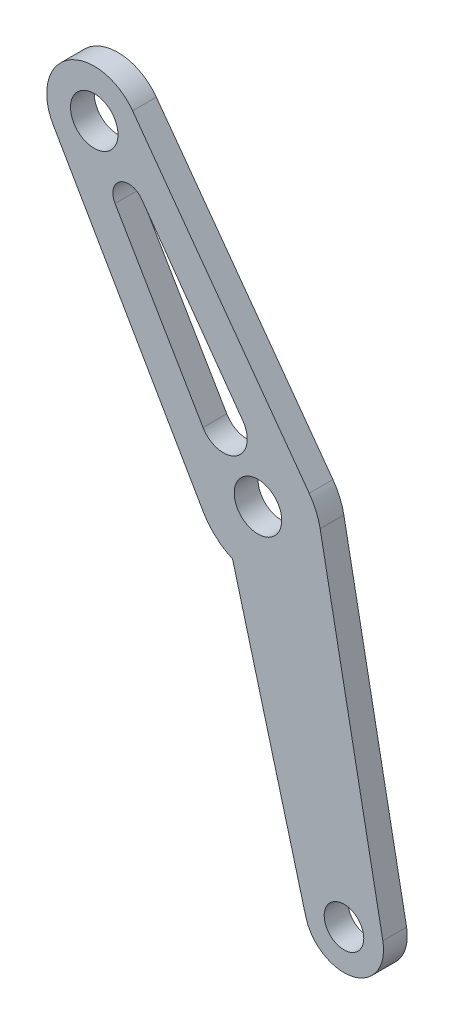
ISO-10303-21;
HEADER;
FILE_DESCRIPTION(('STEP AP214'),'2;1');
FILE_NAME('part.step','',(''),(''),'','','');
FILE_SCHEMA(('AUTOMOTIVE_DESIGN { 1 0 10303 214 1 1 1 1 }'));
ENDSEC;
DATA;
#1=APPLICATION_CONTEXT('core data for automotive mechanical design processes');
#2=APPLICATION_PROTOCOL_DEFINITION('international standard','automotive_design',2000,#1);
#3=PRODUCT_CONTEXT('',#1,'mechanical');
#4=PRODUCT('Part','Part','',(#3));
#5=PRODUCT_RELATED_PRODUCT_CATEGORY('part','',(#4));
#6=PRODUCT_DEFINITION_FORMATION('','',#4);
#7=PRODUCT_DEFINITION_CONTEXT('part definition',#1,'design');
#8=PRODUCT_DEFINITION('design','',#6,#7);
#9=PRODUCT_DEFINITION_SHAPE('','',#8);
#10=(LENGTH_UNIT() NAMED_UNIT(*) SI_UNIT(.MILLI.,.METRE.));
#11=(NAMED_UNIT(*) PLANE_ANGLE_UNIT() SI_UNIT($,.RADIAN.));
#12=(NAMED_UNIT(*) SI_UNIT($,.STERADIAN.) SOLID_ANGLE_UNIT());
#13=UNCERTAINTY_MEASURE_WITH_UNIT(LENGTH_MEASURE(1.E-05),#10,'distance_accuracy_value','');
#14=(GEOMETRIC_REPRESENTATION_CONTEXT(3) GLOBAL_UNCERTAINTY_ASSIGNED_CONTEXT((#13)) GLOBAL_UNIT_ASSIGNED_CONTEXT((#10,
#11,#12)) REPRESENTATION_CONTEXT('',''));
#15=CARTESIAN_POINT('',(0.,0.,0.));
#16=DIRECTION('',(0.,0.,1.));
#17=DIRECTION('',(1.,0.,0.));
#18=AXIS2_PLACEMENT_3D('',#15,#16,#17);
#19=CARTESIAN_POINT('',(4.90972826709962,0.945816231222002,3.));
#20=DIRECTION('',(-0.981945653419923,-0.1891632462444,0.));
#21=DIRECTION('',(0.1891632462444,-0.981945653419924,0.));
#22=AXIS2_PLACEMENT_3D('',#19,#20,#21);
#23=PLANE('',#22);
#24=DIRECTION('',(-0.1891632462444,0.981945653419924,0.));
#25=VECTOR('',#24,1.);
#26=CARTESIAN_POINT('',(4.90972826709962,0.945816231222002,0.));
#27=LINE('',#26,#25);
#28=CARTESIAN_POINT('',(4.90972826709962,0.945816231222002,0.));
#29=VERTEX_POINT('',#28);
#30=CARTESIAN_POINT('',(-3.01483466694652,42.0821906740961,0.));
#31=VERTEX_POINT('',#30);
#32=EDGE_CURVE('E192',#29,#31,#27,.T.);
#33=ORIENTED_EDGE('',*,*,#32,.T.);
#34=DIRECTION('',(0.,0.,-1.));
#35=VECTOR('',#34,1.);
#36=CARTESIAN_POINT('',(-3.01483466694652,42.0821906740961,3.));
#37=LINE('',#36,#35);
#38=CARTESIAN_POINT('',(-3.01483466694652,42.0821906740961,3.));
#39=VERTEX_POINT('',#38);
#40=EDGE_CURVE('E13',#39,#31,#37,.T.);
#41=ORIENTED_EDGE('',*,*,#40,.F.);
#42=DIRECTION('',(-0.1891632462444,0.981945653419924,0.));
#43=VECTOR('',#42,1.);
#44=CARTESIAN_POINT('',(4.90972826709962,0.945816231222002,3.));
#45=LINE('',#44,#43);
#46=CARTESIAN_POINT('',(4.90972826709962,0.945816231222002,3.));
#47=VERTEX_POINT('',#46);
#48=EDGE_CURVE('E259',#47,#39,#45,.T.);
#49=ORIENTED_EDGE('',*,*,#48,.F.);
#50=DIRECTION('',(0.,0.,-1.));
#51=VECTOR('',#50,1.);
#52=CARTESIAN_POINT('',(4.90972826709962,0.945816231222002,3.));
#53=LINE('',#52,#51);
#54=EDGE_CURVE('E209',#47,#29,#53,.T.);
#55=ORIENTED_EDGE('',*,*,#54,.T.);
#56=EDGE_LOOP('',(#33,#41,#49,#55));
#57=FACE_BOUND('',#56,.T.);
#58=ADVANCED_FACE('F47',(#57),#23,.F.);
#59=CARTESIAN_POINT('',(-10.8703998943059,40.5688847041409,3.));
#60=DIRECTION('',(0.,0.,-1.));
#61=DIRECTION('',(-1.,0.,0.));
#62=AXIS2_PLACEMENT_3D('',#59,#60,#61);
#63=CYLINDRICAL_SURFACE('',#62,8.);
#64=CARTESIAN_POINT('',(-10.8703998943059,40.5688847041409,0.));
#65=DIRECTION('',(0.,0.,1.));
#66=DIRECTION('',(1.,0.,0.));
#67=AXIS2_PLACEMENT_3D('',#64,#65,#66);
#68=CIRCLE('',#67,8.);
#69=CARTESIAN_POINT('',(-4.39965624272183,45.2730824673609,0.));
#70=VERTEX_POINT('',#69);
#71=EDGE_CURVE('E195',#31,#70,#68,.T.);
#72=ORIENTED_EDGE('',*,*,#71,.T.);
#73=DIRECTION('',(0.,0.,-1.));
#74=VECTOR('',#73,1.);
#75=CARTESIAN_POINT('',(-4.39965624272183,45.2730824673609,3.));
#76=LINE('',#75,#74);
#77=CARTESIAN_POINT('',(-4.39965624272183,45.2730824673609,3.));
#78=VERTEX_POINT('',#77);
#79=EDGE_CURVE('E57',#78,#70,#76,.T.);
#80=ORIENTED_EDGE('',*,*,#79,.F.);
#81=CARTESIAN_POINT('',(-10.8703998943059,40.5688847041409,3.));
#82=DIRECTION('',(0.,0.,1.));
#83=DIRECTION('',(1.,0.,0.));
#84=AXIS2_PLACEMENT_3D('',#81,#82,#83);
#85=CIRCLE('',#84,8.);
#86=EDGE_CURVE('E261',#39,#78,#85,.T.);
#87=ORIENTED_EDGE('',*,*,#86,.F.);
#88=ORIENTED_EDGE('',*,*,#40,.T.);
#89=EDGE_LOOP('',(#72,#80,#87,#88));
#90=FACE_BOUND('',#89,.T.);
#91=ADVANCED_FACE('F294',(#90),#63,.T.);
#92=CARTESIAN_POINT('',(18.6543941988296,13.5616498179272,3.));
#93=DIRECTION('',(0.808842956448011,0.588024720402503,0.));
#94=DIRECTION('',(-0.588024720402503,0.808842956448011,0.));
#95=AXIS2_PLACEMENT_3D('',#92,#93,#94);
#96=PLANE('',#95);
#97=DIRECTION('',(0.588024720402503,-0.808842956448011,0.));
#98=VECTOR('',#97,1.);
#99=CARTESIAN_POINT('',(18.6543941988296,13.5616498179272,0.));
#100=LINE('',#99,#98);
#101=CARTESIAN_POINT('',(-26.7136254861889,75.966514608482,0.));
#102=VERTEX_POINT('',#101);
#103=EDGE_CURVE('E198',#102,#70,#100,.T.);
#104=ORIENTED_EDGE('',*,*,#103,.F.);
#105=DIRECTION('',(0.,0.,-1.));
#106=VECTOR('',#105,1.);
#107=CARTESIAN_POINT('',(-26.7136254861889,75.966514608482,3.));
#108=LINE('',#107,#106);
#109=CARTESIAN_POINT('',(-26.7136254861889,75.966514608482,3.));
#110=VERTEX_POINT('',#109);
#111=EDGE_CURVE('E216',#110,#102,#108,.T.);
#112=ORIENTED_EDGE('',*,*,#111,.F.);
#113=DIRECTION('',(0.588024720402503,-0.808842956448011,0.));
#114=VECTOR('',#113,1.);
#115=CARTESIAN_POINT('',(18.6543941988296,13.5616498179272,3.));
#116=LINE('',#115,#114);
#117=EDGE_CURVE('E263',#110,#78,#116,.T.);
#118=ORIENTED_EDGE('',*,*,#117,.T.);
#119=ORIENTED_EDGE('',*,*,#79,.T.);
#120=EDGE_LOOP('',(#104,#112,#118,#119));
#121=FACE_BOUND('',#120,.T.);
#122=ADVANCED_FACE('F299',(#121),#96,.T.);
#123=CARTESIAN_POINT('',(-31.566683224877,72.438366286067,3.));
#124=DIRECTION('',(0.,0.,-1.));
#125=DIRECTION('',(-1.,0.,0.));
#126=AXIS2_PLACEMENT_3D('',#123,#124,#125);
#127=CYLINDRICAL_SURFACE('',#126,6.);
#128=CARTESIAN_POINT('',(-31.566683224877,72.438366286067,0.));
#129=DIRECTION('',(0.,0.,1.));
#130=DIRECTION('',(1.,0.,0.));
#131=AXIS2_PLACEMENT_3D('',#128,#129,#130);
#132=CIRCLE('',#131,6.);
#133=CARTESIAN_POINT('',(-36.7637235119956,69.4399046381438,0.));
#134=VERTEX_POINT('',#133);
#135=EDGE_CURVE('E201',#102,#134,#132,.T.);
#136=ORIENTED_EDGE('',*,*,#135,.T.);
#137=DIRECTION('',(0.,0.,-1.));
#138=VECTOR('',#137,1.);
#139=CARTESIAN_POINT('',(-36.7637235119956,69.4399046381438,3.));
#140=LINE('',#139,#138);
#141=CARTESIAN_POINT('',(-36.7637235119956,69.4399046381438,3.));
#142=VERTEX_POINT('',#141);
#143=EDGE_CURVE('E213',#142,#134,#140,.T.);
#144=ORIENTED_EDGE('',*,*,#143,.F.);
#145=CARTESIAN_POINT('',(-31.566683224877,72.438366286067,3.));
#146=DIRECTION('',(0.,0.,1.));
#147=DIRECTION('',(1.,0.,0.));
#148=AXIS2_PLACEMENT_3D('',#145,#146,#147);
#149=CIRCLE('',#148,6.);
#150=EDGE_CURVE('E266',#110,#142,#149,.T.);
#151=ORIENTED_EDGE('',*,*,#150,.F.);
#152=ORIENTED_EDGE('',*,*,#111,.T.);
#153=EDGE_LOOP('',(#136,#144,#151,#152));
#154=FACE_BOUND('',#153,.T.);
#155=ADVANCED_FACE('F271',(#154),#127,.T.);
#156=CARTESIAN_POINT('',(2.47586114288567,1.42846202307234,3.));
#157=DIRECTION('',(0.866173381186435,0.499743607987195,0.));
#158=DIRECTION('',(-0.499743607987195,0.866173381186435,0.));
#159=AXIS2_PLACEMENT_3D('',#156,#157,#158);
#160=PLANE('',#159);
#161=DIRECTION('',(0.499743607987195,-0.866173381186435,0.));
#162=VECTOR('',#161,1.);
#163=CARTESIAN_POINT('',(2.47586114288567,1.42846202307234,0.));
#164=LINE('',#163,#162);
#165=CARTESIAN_POINT('',(-17.7997869437974,36.5709358402433,0.));
#166=VERTEX_POINT('',#165);
#167=EDGE_CURVE('E203',#134,#166,#164,.T.);
#168=ORIENTED_EDGE('',*,*,#167,.T.);
#169=DIRECTION('',(0.,0.,-1.));
#170=VECTOR('',#169,1.);
#171=CARTESIAN_POINT('',(-17.7997869437974,36.5709358402433,3.));
#172=LINE('',#171,#170);
#173=CARTESIAN_POINT('',(-17.7997869437974,36.5709358402433,3.));
#174=VERTEX_POINT('',#173);
#175=EDGE_CURVE('E162',#174,#166,#172,.T.);
#176=ORIENTED_EDGE('',*,*,#175,.F.);
#177=DIRECTION('',(0.499743607987195,-0.866173381186435,0.));
#178=VECTOR('',#177,1.);
#179=CARTESIAN_POINT('',(2.47586114288567,1.42846202307234,3.));
#180=LINE('',#179,#178);
#181=EDGE_CURVE('E153',#142,#174,#180,.T.);
#182=ORIENTED_EDGE('',*,*,#181,.F.);
#183=ORIENTED_EDGE('',*,*,#143,.T.);
#184=EDGE_LOOP('',(#168,#176,#182,#183));
#185=FACE_BOUND('',#184,.T.);
#186=ADVANCED_FACE('F275',(#185),#160,.F.);
#187=CARTESIAN_POINT('',(-10.8703998943059,40.5688847041409,3.));
#188=DIRECTION('',(0.,0.,-1.));
#189=DIRECTION('',(-1.,0.,0.));
#190=AXIS2_PLACEMENT_3D('',#187,#188,#189);
#191=CYLINDRICAL_SURFACE('',#190,8.00000000000001);
#192=CARTESIAN_POINT('',(-10.8703998943059,40.5688847041409,0.));
#193=DIRECTION('',(0.,0.,1.));
#194=DIRECTION('',(1.,0.,0.));
#195=AXIS2_PLACEMENT_3D('',#192,#193,#194);
#196=CIRCLE('',#195,8.00000000000001);
#197=CARTESIAN_POINT('',(-14.0837046071386,33.2425846268517,0.));
#198=VERTEX_POINT('',#197);
#199=EDGE_CURVE('E161',#166,#198,#196,.T.);
#200=ORIENTED_EDGE('',*,*,#199,.T.);
#201=DIRECTION('',(0.,0.,-1.));
#202=VECTOR('',#201,1.);
#203=CARTESIAN_POINT('',(-14.0837046071386,33.2425846268517,3.));
#204=LINE('',#203,#202);
#205=CARTESIAN_POINT('',(-14.0837046071386,33.2425846268517,3.));
#206=VERTEX_POINT('',#205);
#207=EDGE_CURVE('E158',#206,#198,#204,.T.);
#208=ORIENTED_EDGE('',*,*,#207,.F.);
#209=CARTESIAN_POINT('',(-10.8703998943059,40.5688847041409,3.));
#210=DIRECTION('',(0.,0.,1.));
#211=DIRECTION('',(1.,0.,0.));
#212=AXIS2_PLACEMENT_3D('',#209,#210,#211);
#213=CIRCLE('',#212,8.00000000000001);
#214=EDGE_CURVE('E147',#174,#206,#213,.T.);
#215=ORIENTED_EDGE('',*,*,#214,.F.);
#216=ORIENTED_EDGE('',*,*,#175,.T.);
#217=EDGE_LOOP('',(#200,#208,#215,#216));
#218=FACE_BOUND('',#217,.T.);
#219=ADVANCED_FACE('F159',(#218),#191,.T.);
#220=CARTESIAN_POINT('',(-4.82962913144533,-1.29409522551261,3.));
#221=DIRECTION('',(0.965925826289068,0.258819045102522,0.));
#222=DIRECTION('',(-0.258819045102522,0.965925826289068,0.));
#223=AXIS2_PLACEMENT_3D('',#220,#221,#222);
#224=PLANE('',#223);
#225=DIRECTION('',(0.258819045102522,-0.965925826289068,0.));
#226=VECTOR('',#225,1.);
#227=CARTESIAN_POINT('',(-4.82962913144533,-1.29409522551261,0.));
#228=LINE('',#227,#226);
#229=CARTESIAN_POINT('',(-4.82962913144533,-1.29409522551261,0.));
#230=VERTEX_POINT('',#229);
#231=EDGE_CURVE('E107',#198,#230,#228,.T.);
#232=ORIENTED_EDGE('',*,*,#231,.T.);
#233=DIRECTION('',(0.,0.,-1.));
#234=VECTOR('',#233,1.);
#235=CARTESIAN_POINT('',(-4.82962913144533,-1.29409522551261,3.));
#236=LINE('',#235,#234);
#237=CARTESIAN_POINT('',(-4.82962913144533,-1.29409522551261,3.));
#238=VERTEX_POINT('',#237);
#239=EDGE_CURVE('E163',#238,#230,#236,.T.);
#240=ORIENTED_EDGE('',*,*,#239,.F.);
#241=DIRECTION('',(0.258819045102522,-0.965925826289068,0.));
#242=VECTOR('',#241,1.);
#243=CARTESIAN_POINT('',(-4.82962913144533,-1.29409522551261,3.));
#244=LINE('',#243,#242);
#245=EDGE_CURVE('E151',#206,#238,#244,.T.);
#246=ORIENTED_EDGE('',*,*,#245,.F.);
#247=ORIENTED_EDGE('',*,*,#207,.T.);
#248=EDGE_LOOP('',(#232,#240,#246,#247));
#249=FACE_BOUND('',#248,.T.);
#250=ADVANCED_FACE('F165',(#249),#224,.F.);
#251=CARTESIAN_POINT('',(-15.2275121744261,47.2782492477043,3.));
#252=DIRECTION('',(0.,0.,-1.));
#253=DIRECTION('',(-1.,0.,0.));
#254=AXIS2_PLACEMENT_3D('',#251,#252,#253);
#255=CYLINDRICAL_SURFACE('',#254,3.00000000000001);
#256=CARTESIAN_POINT('',(-15.2275121744261,47.2782492477043,0.));
#257=DIRECTION('',(0.,0.,1.));
#258=DIRECTION('',(1.,0.,0.));
#259=AXIS2_PLACEMENT_3D('',#256,#257,#258);
#260=CIRCLE('',#259,3.00000000000001);
#261=CARTESIAN_POINT('',(-17.8151923079949,45.760385114676,0.));
#262=VERTEX_POINT('',#261);
#263=CARTESIAN_POINT('',(-12.7883699594978,49.0248417174449,0.));
#264=VERTEX_POINT('',#263);
#265=EDGE_CURVE('E171',#262,#264,#260,.T.);
#266=ORIENTED_EDGE('',*,*,#265,.F.);
#267=DIRECTION('',(0.,0.,-1.));
#268=VECTOR('',#267,1.);
#269=CARTESIAN_POINT('',(-17.8151923079949,45.760385114676,3.));
#270=LINE('',#269,#268);
#271=CARTESIAN_POINT('',(-17.8151923079949,45.760385114676,3.));
#272=VERTEX_POINT('',#271);
#273=EDGE_CURVE('E51',#272,#262,#270,.T.);
#274=ORIENTED_EDGE('',*,*,#273,.F.);
#275=CARTESIAN_POINT('',(-15.2275121744261,47.2782492477043,3.));
#276=DIRECTION('',(0.,0.,1.));
#277=DIRECTION('',(1.,0.,0.));
#278=AXIS2_PLACEMENT_3D('',#275,#276,#277);
#279=CIRCLE('',#278,3.00000000000001);
#280=CARTESIAN_POINT('',(-12.7883699594978,49.0248417174449,3.));
#281=VERTEX_POINT('',#280);
#282=EDGE_CURVE('E208',#272,#281,#279,.T.);
#283=ORIENTED_EDGE('',*,*,#282,.T.);
#284=DIRECTION('',(0.,0.,-1.));
#285=VECTOR('',#284,1.);
#286=CARTESIAN_POINT('',(-12.7883699594978,49.0248417174449,3.));
#287=LINE('',#286,#285);
#288=EDGE_CURVE('E167',#281,#264,#287,.T.);
#289=ORIENTED_EDGE('',*,*,#288,.T.);
#290=EDGE_LOOP('',(#266,#274,#283,#289));
#291=FACE_BOUND('',#290,.T.);
#292=ADVANCED_FACE('F49',(#291),#255,.F.);
#293=CARTESIAN_POINT('',(6.71590057677353,3.93936811363535,3.));
#294=DIRECTION('',(0.862560044522915,0.505954711009421,0.));
#295=DIRECTION('',(-0.505954711009421,0.862560044522915,0.));
#296=AXIS2_PLACEMENT_3D('',#293,#294,#295);
#297=PLANE('',#296);
#298=DIRECTION('',(0.505954711009421,-0.862560044522915,0.));
#299=VECTOR('',#298,1.);
#300=CARTESIAN_POINT('',(6.71590057677353,3.93936811363535,0.));
#301=LINE('',#300,#299);
#302=CARTESIAN_POINT('',(-28.9346910338026,64.7170923204847,0.));
#303=VERTEX_POINT('',#302);
#304=EDGE_CURVE('E174',#303,#262,#301,.T.);
#305=ORIENTED_EDGE('',*,*,#304,.F.);
#306=DIRECTION('',(0.,0.,-1.));
#307=VECTOR('',#306,1.);
#308=CARTESIAN_POINT('',(-28.9346910338026,64.7170923204847,3.));
#309=LINE('',#308,#307);
#310=CARTESIAN_POINT('',(-28.9346910338026,64.7170923204847,3.));
#311=VERTEX_POINT('',#310);
#312=EDGE_CURVE('E221',#311,#303,#309,.T.);
#313=ORIENTED_EDGE('',*,*,#312,.F.);
#314=DIRECTION('',(0.505954711009421,-0.862560044522915,0.));
#315=VECTOR('',#314,1.);
#316=CARTESIAN_POINT('',(6.71590057677353,3.93936811363535,3.));
#317=LINE('',#316,#315);
#318=EDGE_CURVE('E230',#311,#272,#317,.T.);
#319=ORIENTED_EDGE('',*,*,#318,.T.);
#320=ORIENTED_EDGE('',*,*,#273,.T.);
#321=EDGE_LOOP('',(#305,#313,#319,#320));
#322=FACE_BOUND('',#321,.T.);
#323=ADVANCED_FACE('F228',(#322),#297,.T.);
#324=CARTESIAN_POINT('',(-27.2095709447568,65.7290017425036,3.));
#325=DIRECTION('',(0.,0.,-1.));
#326=DIRECTION('',(-1.,0.,0.));
#327=AXIS2_PLACEMENT_3D('',#324,#325,#326);
#328=CYLINDRICAL_SURFACE('',#327,2.);
#329=CARTESIAN_POINT('',(-27.2095709447568,65.7290017425036,0.));
#330=DIRECTION('',(0.,0.,1.));
#331=DIRECTION('',(1.,0.,0.));
#332=AXIS2_PLACEMENT_3D('',#329,#330,#331);
#333=CIRCLE('',#332,2.);
#334=CARTESIAN_POINT('',(-25.5834761348046,66.8933967223307,0.));
#335=VERTEX_POINT('',#334);
#336=EDGE_CURVE('E177',#335,#303,#333,.T.);
#337=ORIENTED_EDGE('',*,*,#336,.F.);
#338=DIRECTION('',(0.,0.,-1.));
#339=VECTOR('',#338,1.);
#340=CARTESIAN_POINT('',(-25.5834761348046,66.8933967223307,3.));
#341=LINE('',#340,#339);
#342=CARTESIAN_POINT('',(-25.5834761348046,66.8933967223307,3.));
#343=VERTEX_POINT('',#342);
#344=EDGE_CURVE('E220',#343,#335,#341,.T.);
#345=ORIENTED_EDGE('',*,*,#344,.F.);
#346=CARTESIAN_POINT('',(-27.2095709447568,65.7290017425036,3.));
#347=DIRECTION('',(0.,0.,1.));
#348=DIRECTION('',(1.,0.,0.));
#349=AXIS2_PLACEMENT_3D('',#346,#347,#348);
#350=CIRCLE('',#349,2.);
#351=EDGE_CURVE('E239',#343,#311,#350,.T.);
#352=ORIENTED_EDGE('',*,*,#351,.T.);
#353=ORIENTED_EDGE('',*,*,#312,.T.);
#354=EDGE_LOOP('',(#337,#345,#352,#353));
#355=FACE_BOUND('',#354,.T.);
#356=ADVANCED_FACE('F236',(#355),#328,.F.);
#357=CARTESIAN_POINT('',(-31.566683224877,72.438366286067,3.));
#358=DIRECTION('',(0.,0.,-1.));
#359=DIRECTION('',(-1.,0.,0.));
#360=AXIS2_PLACEMENT_3D('',#357,#358,#359);
#361=CYLINDRICAL_SURFACE('',#360,3.);
#362=CARTESIAN_POINT('',(-31.566683224877,72.438366286067,3.));
#363=DIRECTION('',(0.,0.,1.));
#364=DIRECTION('',(1.,0.,0.));
#365=AXIS2_PLACEMENT_3D('',#362,#363,#364);
#366=CIRCLE('',#365,3.);
#367=CARTESIAN_POINT('',(-28.566683224877,72.438366286067,3.));
#368=VERTEX_POINT('',#367);
#369=EDGE_CURVE('E256',#368,#368,#366,.T.);
#370=ORIENTED_EDGE('',*,*,#369,.T.);
#371=EDGE_LOOP('',(#370));
#372=FACE_BOUND('',#371,.T.);
#373=CARTESIAN_POINT('',(-31.566683224877,72.438366286067,0.));
#374=DIRECTION('',(0.,0.,1.));
#375=DIRECTION('',(1.,0.,0.));
#376=AXIS2_PLACEMENT_3D('',#373,#374,#375);
#377=CIRCLE('',#376,3.);
#378=CARTESIAN_POINT('',(-28.566683224877,72.438366286067,0.));
#379=VERTEX_POINT('',#378);
#380=EDGE_CURVE('E189',#379,#379,#377,.T.);
#381=ORIENTED_EDGE('',*,*,#380,.F.);
#382=EDGE_LOOP('',(#381));
#383=FACE_BOUND('',#382,.T.);
#384=ADVANCED_FACE('F304',(#372,#383),#361,.F.);
#385=CARTESIAN_POINT('',(-10.8703998943059,40.5688847041409,3.));
#386=DIRECTION('',(0.,0.,-1.));
#387=DIRECTION('',(-1.,0.,0.));
#388=AXIS2_PLACEMENT_3D('',#385,#386,#387);
#389=CYLINDRICAL_SURFACE('',#388,3.);
#390=CARTESIAN_POINT('',(-10.8703998943059,40.5688847041409,3.));
#391=DIRECTION('',(0.,0.,1.));
#392=DIRECTION('',(1.,0.,0.));
#393=AXIS2_PLACEMENT_3D('',#390,#391,#392);
#394=CIRCLE('',#393,3.);
#395=CARTESIAN_POINT('',(-7.87039989430591,40.5688847041409,3.));
#396=VERTEX_POINT('',#395);
#397=EDGE_CURVE('E253',#396,#396,#394,.T.);
#398=ORIENTED_EDGE('',*,*,#397,.T.);
#399=EDGE_LOOP('',(#398));
#400=FACE_BOUND('',#399,.T.);
#401=CARTESIAN_POINT('',(-10.8703998943059,40.5688847041409,0.));
#402=DIRECTION('',(0.,0.,1.));
#403=DIRECTION('',(1.,0.,0.));
#404=AXIS2_PLACEMENT_3D('',#401,#402,#403);
#405=CIRCLE('',#404,3.);
#406=CARTESIAN_POINT('',(-7.87039989430591,40.5688847041409,0.));
#407=VERTEX_POINT('',#406);
#408=EDGE_CURVE('E186',#407,#407,#405,.T.);
#409=ORIENTED_EDGE('',*,*,#408,.F.);
#410=EDGE_LOOP('',(#409));
#411=FACE_BOUND('',#410,.T.);
#412=ADVANCED_FACE('F307',(#400,#411),#389,.F.);
#413=CARTESIAN_POINT('',(0.,0.,3.));
#414=DIRECTION('',(0.,0.,-1.));
#415=DIRECTION('',(-1.,0.,0.));
#416=AXIS2_PLACEMENT_3D('',#413,#414,#415);
#417=CYLINDRICAL_SURFACE('',#416,2.5);
#418=CARTESIAN_POINT('',(0.,0.,3.));
#419=DIRECTION('',(0.,0.,1.));
#420=DIRECTION('',(1.,0.,0.));
#421=AXIS2_PLACEMENT_3D('',#418,#419,#420);
#422=CIRCLE('',#421,2.5);
#423=CARTESIAN_POINT('',(2.5,0.,3.));
#424=VERTEX_POINT('',#423);
#425=EDGE_CURVE('E244',#424,#424,#422,.T.);
#426=ORIENTED_EDGE('',*,*,#425,.T.);
#427=EDGE_LOOP('',(#426));
#428=FACE_BOUND('',#427,.T.);
#429=CARTESIAN_POINT('',(0.,0.,0.));
#430=DIRECTION('',(0.,0.,1.));
#431=DIRECTION('',(1.,0.,0.));
#432=AXIS2_PLACEMENT_3D('',#429,#430,#431);
#433=CIRCLE('',#432,2.5);
#434=CARTESIAN_POINT('',(2.5,0.,0.));
#435=VERTEX_POINT('',#434);
#436=EDGE_CURVE('E183',#435,#435,#433,.T.);
#437=ORIENTED_EDGE('',*,*,#436,.F.);
#438=EDGE_LOOP('',(#437));
#439=FACE_BOUND('',#438,.T.);
#440=ADVANCED_FACE('F289',(#428,#439),#417,.F.);
#441=CARTESIAN_POINT('',(14.7524108234509,10.5637340443134,3.));
#442=DIRECTION('',(0.813047404976094,0.582197489913552,0.));
#443=DIRECTION('',(-0.582197489913552,0.813047404976094,0.));
#444=AXIS2_PLACEMENT_3D('',#441,#442,#443);
#445=PLANE('',#444);
#446=DIRECTION('',(0.582197489913552,-0.813047404976094,0.));
#447=VECTOR('',#446,1.);
#448=CARTESIAN_POINT('',(14.7524108234509,10.5637340443134,0.));
#449=LINE('',#448,#447);
#450=EDGE_CURVE('E180',#335,#264,#449,.T.);
#451=ORIENTED_EDGE('',*,*,#450,.T.);
#452=ORIENTED_EDGE('',*,*,#288,.F.);
#453=DIRECTION('',(0.582197489913552,-0.813047404976094,0.));
#454=VECTOR('',#453,1.);
#455=CARTESIAN_POINT('',(14.7524108234509,10.5637340443134,3.));
#456=LINE('',#455,#454);
#457=EDGE_CURVE('E241',#343,#281,#456,.T.);
#458=ORIENTED_EDGE('',*,*,#457,.F.);
#459=ORIENTED_EDGE('',*,*,#344,.T.);
#460=EDGE_LOOP('',(#451,#452,#458,#459));
#461=FACE_BOUND('',#460,.T.);
#462=ADVANCED_FACE('F242',(#461),#445,.F.);
#463=CARTESIAN_POINT('',(0.,0.,3.));
#464=DIRECTION('',(0.,0.,-1.));
#465=DIRECTION('',(-1.,0.,0.));
#466=AXIS2_PLACEMENT_3D('',#463,#464,#465);
#467=CYLINDRICAL_SURFACE('',#466,5.);
#468=CARTESIAN_POINT('',(0.,0.,0.));
#469=DIRECTION('',(0.,0.,1.));
#470=DIRECTION('',(1.,0.,0.));
#471=AXIS2_PLACEMENT_3D('',#468,#469,#470);
#472=CIRCLE('',#471,5.);
#473=EDGE_CURVE('E113',#230,#29,#472,.T.);
#474=ORIENTED_EDGE('',*,*,#473,.T.);
#475=ORIENTED_EDGE('',*,*,#54,.F.);
#476=CARTESIAN_POINT('',(0.,0.,3.));
#477=DIRECTION('',(0.,0.,1.));
#478=DIRECTION('',(1.,0.,0.));
#479=AXIS2_PLACEMENT_3D('',#476,#477,#478);
#480=CIRCLE('',#479,5.);
#481=EDGE_CURVE('E66',#238,#47,#480,.T.);
#482=ORIENTED_EDGE('',*,*,#481,.F.);
#483=ORIENTED_EDGE('',*,*,#239,.T.);
#484=EDGE_LOOP('',(#474,#475,#482,#483));
#485=FACE_BOUND('',#484,.T.);
#486=ADVANCED_FACE('F281',(#485),#467,.T.);
#487=CARTESIAN_POINT('',(0.,0.,3.));
#488=DIRECTION('',(0.,0.,1.));
#489=DIRECTION('',(1.,0.,0.));
#490=AXIS2_PLACEMENT_3D('',#487,#488,#489);
#491=PLANE('',#490);
#492=ORIENTED_EDGE('',*,*,#282,.F.);
#493=ORIENTED_EDGE('',*,*,#318,.F.);
#494=ORIENTED_EDGE('',*,*,#351,.F.);
#495=ORIENTED_EDGE('',*,*,#457,.T.);
#496=EDGE_LOOP('',(#492,#493,#494,#495));
#497=FACE_BOUND('',#496,.T.);
#498=ORIENTED_EDGE('',*,*,#425,.F.);
#499=EDGE_LOOP('',(#498));
#500=FACE_BOUND('',#499,.T.);
#501=ORIENTED_EDGE('',*,*,#397,.F.);
#502=EDGE_LOOP('',(#501));
#503=FACE_BOUND('',#502,.T.);
#504=ORIENTED_EDGE('',*,*,#369,.F.);
#505=EDGE_LOOP('',(#504));
#506=FACE_BOUND('',#505,.T.);
#507=ORIENTED_EDGE('',*,*,#48,.T.);
#508=ORIENTED_EDGE('',*,*,#86,.T.);
#509=ORIENTED_EDGE('',*,*,#117,.F.);
#510=ORIENTED_EDGE('',*,*,#150,.T.);
#511=ORIENTED_EDGE('',*,*,#181,.T.);
#512=ORIENTED_EDGE('',*,*,#214,.T.);
#513=ORIENTED_EDGE('',*,*,#245,.T.);
#514=ORIENTED_EDGE('',*,*,#481,.T.);
#515=EDGE_LOOP('',(#507,#508,#509,#510,#511,#512,#513,#514));
#516=FACE_BOUND('',#515,.T.);
#517=ADVANCED_FACE('F149',(#497,#500,#503,#506,#516),#491,.T.);
#518=CARTESIAN_POINT('',(0.,0.,0.));
#519=DIRECTION('',(0.,0.,1.));
#520=DIRECTION('',(1.,0.,0.));
#521=AXIS2_PLACEMENT_3D('',#518,#519,#520);
#522=PLANE('',#521);
#523=ORIENTED_EDGE('',*,*,#265,.T.);
#524=ORIENTED_EDGE('',*,*,#450,.F.);
#525=ORIENTED_EDGE('',*,*,#336,.T.);
#526=ORIENTED_EDGE('',*,*,#304,.T.);
#527=EDGE_LOOP('',(#523,#524,#525,#526));
#528=FACE_BOUND('',#527,.T.);
#529=ORIENTED_EDGE('',*,*,#436,.T.);
#530=EDGE_LOOP('',(#529));
#531=FACE_BOUND('',#530,.T.);
#532=ORIENTED_EDGE('',*,*,#408,.T.);
#533=EDGE_LOOP('',(#532));
#534=FACE_BOUND('',#533,.T.);
#535=ORIENTED_EDGE('',*,*,#380,.T.);
#536=EDGE_LOOP('',(#535));
#537=FACE_BOUND('',#536,.T.);
#538=ORIENTED_EDGE('',*,*,#32,.F.);
#539=ORIENTED_EDGE('',*,*,#473,.F.);
#540=ORIENTED_EDGE('',*,*,#231,.F.);
#541=ORIENTED_EDGE('',*,*,#199,.F.);
#542=ORIENTED_EDGE('',*,*,#167,.F.);
#543=ORIENTED_EDGE('',*,*,#135,.F.);
#544=ORIENTED_EDGE('',*,*,#103,.T.);
#545=ORIENTED_EDGE('',*,*,#71,.F.);
#546=EDGE_LOOP('',(#538,#539,#540,#541,#542,#543,#544,#545));
#547=FACE_BOUND('',#546,.T.);
#548=ADVANCED_FACE('F234',(#528,#531,#534,#537,#547),#522,.F.);
#549=CLOSED_SHELL('',(#58,#91,#122,#155,#186,#219,#250,#292,#323,#356,#384,#412,#440,#462,#486,
#517,#548));
#550=MANIFOLD_SOLID_BREP('B2',#549);
#551=ADVANCED_BREP_SHAPE_REPRESENTATION('',(#18,#550),#14);
#552=SHAPE_DEFINITION_REPRESENTATION(#9,#551);
ENDSEC;
END-ISO-10303-21;
